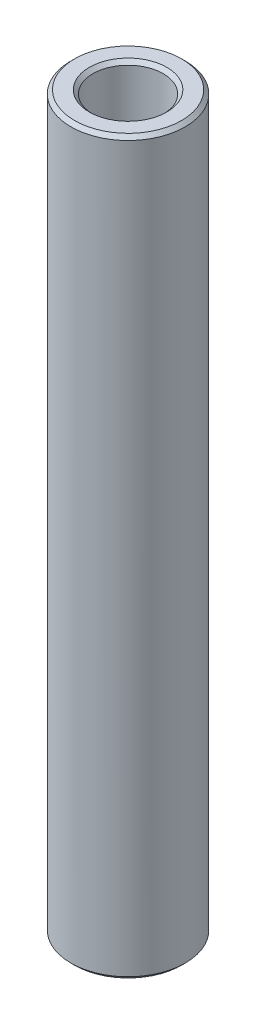
ISO-10303-21;
HEADER;
FILE_DESCRIPTION(('STEP AP214'),'2;1');
FILE_NAME('part.step','',(''),(''),'','','');
FILE_SCHEMA(('AUTOMOTIVE_DESIGN { 1 0 10303 214 1 1 1 1 }'));
ENDSEC;
DATA;
#1=APPLICATION_CONTEXT('core data for automotive mechanical design processes');
#2=APPLICATION_PROTOCOL_DEFINITION('international standard','automotive_design',2000,#1);
#3=PRODUCT_CONTEXT('',#1,'mechanical');
#4=PRODUCT('Part','Part','',(#3));
#5=PRODUCT_RELATED_PRODUCT_CATEGORY('part','',(#4));
#6=PRODUCT_DEFINITION_FORMATION('','',#4);
#7=PRODUCT_DEFINITION_CONTEXT('part definition',#1,'design');
#8=PRODUCT_DEFINITION('design','',#6,#7);
#9=PRODUCT_DEFINITION_SHAPE('','',#8);
#10=(LENGTH_UNIT() NAMED_UNIT(*) SI_UNIT(.MILLI.,.METRE.));
#11=(NAMED_UNIT(*) PLANE_ANGLE_UNIT() SI_UNIT($,.RADIAN.));
#12=(NAMED_UNIT(*) SI_UNIT($,.STERADIAN.) SOLID_ANGLE_UNIT());
#13=UNCERTAINTY_MEASURE_WITH_UNIT(LENGTH_MEASURE(1.E-05),#10,'distance_accuracy_value','');
#14=(GEOMETRIC_REPRESENTATION_CONTEXT(3) GLOBAL_UNCERTAINTY_ASSIGNED_CONTEXT((#13)) GLOBAL_UNIT_ASSIGNED_CONTEXT((#10,
#11,#12)) REPRESENTATION_CONTEXT('',''));
#15=CARTESIAN_POINT('',(0.,0.,0.));
#16=DIRECTION('',(0.,0.,1.));
#17=DIRECTION('',(1.,0.,0.));
#18=AXIS2_PLACEMENT_3D('',#15,#16,#17);
#19=CARTESIAN_POINT('',(0.,50.8,0.));
#20=DIRECTION('',(0.,-1.,0.));
#21=DIRECTION('',(0.,0.,-1.));
#22=AXIS2_PLACEMENT_3D('',#19,#20,#21);
#23=CYLINDRICAL_SURFACE('',#22,2.4384);
#24=CARTESIAN_POINT('',(0.,50.5459999999971,0.));
#25=DIRECTION('',(0.,1.,0.));
#26=DIRECTION('',(0.,0.,1.));
#27=AXIS2_PLACEMENT_3D('',#24,#25,#26);
#28=CIRCLE('',#27,2.43840000001683);
#29=CARTESIAN_POINT('',(0.,50.5459999999971,2.43840000001683));
#30=VERTEX_POINT('',#29);
#31=EDGE_CURVE('E34',#30,#30,#28,.T.);
#32=ORIENTED_EDGE('',*,*,#31,.T.);
#33=EDGE_LOOP('',(#32));
#34=FACE_BOUND('',#33,.T.);
#35=CARTESIAN_POINT('',(0.,0.253999999983989,0.));
#36=DIRECTION('',(0.,-1.,0.));
#37=DIRECTION('',(0.,0.,-1.));
#38=AXIS2_PLACEMENT_3D('',#35,#36,#37);
#39=CIRCLE('',#38,2.43840000007367);
#40=CARTESIAN_POINT('',(0.,0.253999999983989,-2.43840000007367));
#41=VERTEX_POINT('',#40);
#42=EDGE_CURVE('E38',#41,#41,#39,.T.);
#43=ORIENTED_EDGE('',*,*,#42,.T.);
#44=EDGE_LOOP('',(#43));
#45=FACE_BOUND('',#44,.T.);
#46=ADVANCED_FACE('F15',(#34,#45),#23,.F.);
#47=CARTESIAN_POINT('',(0.,0.,0.));
#48=DIRECTION('',(0.,-1.,0.));
#49=DIRECTION('',(0.,0.,-1.));
#50=AXIS2_PLACEMENT_3D('',#47,#48,#49);
#51=CONICAL_SURFACE('',#50,2.69240000005766,0.785398163397448);
#52=CARTESIAN_POINT('',(0.,0.,0.));
#53=DIRECTION('',(0.,-1.,0.));
#54=DIRECTION('',(0.,0.,-1.));
#55=AXIS2_PLACEMENT_3D('',#52,#53,#54);
#56=CIRCLE('',#55,2.69240000005766);
#57=CARTESIAN_POINT('',(0.,0.,-2.69240000005766));
#58=VERTEX_POINT('',#57);
#59=EDGE_CURVE('E37',#58,#58,#56,.T.);
#60=ORIENTED_EDGE('',*,*,#59,.T.);
#61=EDGE_LOOP('',(#60));
#62=FACE_BOUND('',#61,.T.);
#63=ORIENTED_EDGE('',*,*,#42,.F.);
#64=EDGE_LOOP('',(#63));
#65=FACE_BOUND('',#64,.T.);
#66=ADVANCED_FACE('F61',(#62,#65),#51,.F.);
#67=CARTESIAN_POINT('',(0.,50.7999999999242,0.));
#68=DIRECTION('',(0.,1.,0.));
#69=DIRECTION('',(-1.,0.,0.));
#70=AXIS2_PLACEMENT_3D('',#67,#68,#69);
#71=CONICAL_SURFACE('',#70,2.69239999994397,0.785398163397448);
#72=ORIENTED_EDGE('',*,*,#31,.F.);
#73=EDGE_LOOP('',(#72));
#74=FACE_BOUND('',#73,.T.);
#75=CARTESIAN_POINT('',(0.,50.7999999999811,0.));
#76=DIRECTION('',(0.,1.,0.));
#77=DIRECTION('',(-1.,0.,0.));
#78=AXIS2_PLACEMENT_3D('',#75,#76,#77);
#79=CIRCLE('',#78,2.69240000000082);
#80=CARTESIAN_POINT('',(-2.69240000000082,50.7999999999811,0.));
#81=VERTEX_POINT('',#80);
#82=EDGE_CURVE('E52',#81,#81,#79,.F.);
#83=ORIENTED_EDGE('',*,*,#82,.F.);
#84=EDGE_LOOP('',(#83));
#85=FACE_BOUND('',#84,.T.);
#86=ADVANCED_FACE('F68',(#74,#85),#71,.F.);
#87=CARTESIAN_POINT('',(0.,0.,0.));
#88=DIRECTION('',(0.,1.,0.));
#89=DIRECTION('',(0.,0.,1.));
#90=AXIS2_PLACEMENT_3D('',#87,#88,#89);
#91=PLANE('',#90);
#92=ORIENTED_EDGE('',*,*,#59,.F.);
#93=EDGE_LOOP('',(#92));
#94=FACE_BOUND('',#93,.T.);
#95=CARTESIAN_POINT('',(0.,-5.6843418860808E-11,0.));
#96=DIRECTION('',(0.,1.,0.));
#97=DIRECTION('',(0.,0.,1.));
#98=AXIS2_PLACEMENT_3D('',#95,#96,#97);
#99=CIRCLE('',#98,3.7147499999719);
#100=CARTESIAN_POINT('',(0.,-5.6843418860808E-11,3.7147499999719));
#101=VERTEX_POINT('',#100);
#102=EDGE_CURVE('E47',#101,#101,#99,.T.);
#103=ORIENTED_EDGE('',*,*,#102,.F.);
#104=EDGE_LOOP('',(#103));
#105=FACE_BOUND('',#104,.T.);
#106=ADVANCED_FACE('F64',(#94,#105),#91,.F.);
#107=CARTESIAN_POINT('',(0.,50.8,0.));
#108=DIRECTION('',(0.,1.,0.));
#109=DIRECTION('',(0.,0.,1.));
#110=AXIS2_PLACEMENT_3D('',#107,#108,#109);
#111=PLANE('',#110);
#112=ORIENTED_EDGE('',*,*,#82,.T.);
#113=EDGE_LOOP('',(#112));
#114=FACE_BOUND('',#113,.T.);
#115=CARTESIAN_POINT('',(0.,50.7999999999242,0.));
#116=DIRECTION('',(0.,-1.,0.));
#117=DIRECTION('',(1.,0.,0.));
#118=AXIS2_PLACEMENT_3D('',#115,#116,#117);
#119=CIRCLE('',#118,3.71475000002874);
#120=CARTESIAN_POINT('',(3.71475000002874,50.7999999999242,0.));
#121=VERTEX_POINT('',#120);
#122=EDGE_CURVE('E27',#121,#121,#119,.T.);
#123=ORIENTED_EDGE('',*,*,#122,.F.);
#124=EDGE_LOOP('',(#123));
#125=FACE_BOUND('',#124,.T.);
#126=ADVANCED_FACE('F67',(#114,#125),#111,.T.);
#127=CARTESIAN_POINT('',(0.,0.253999999870302,0.));
#128=DIRECTION('',(0.,1.,0.));
#129=DIRECTION('',(0.,0.,1.));
#130=AXIS2_PLACEMENT_3D('',#127,#128,#129);
#131=CONICAL_SURFACE('',#130,3.96874999989905,0.785398163397448);
#132=CARTESIAN_POINT('',(0.,0.25399999999999,0.));
#133=DIRECTION('',(0.,-1.,0.));
#134=DIRECTION('',(0.,0.,-1.));
#135=AXIS2_PLACEMENT_3D('',#132,#133,#134);
#136=CIRCLE('',#135,3.96875);
#137=CARTESIAN_POINT('',(0.,0.25399999999999,-3.96875));
#138=VERTEX_POINT('',#137);
#139=EDGE_CURVE('E22',#138,#138,#136,.F.);
#140=ORIENTED_EDGE('',*,*,#139,.F.);
#141=EDGE_LOOP('',(#140));
#142=FACE_BOUND('',#141,.T.);
#143=ORIENTED_EDGE('',*,*,#102,.T.);
#144=EDGE_LOOP('',(#143));
#145=FACE_BOUND('',#144,.T.);
#146=ADVANCED_FACE('F72',(#142,#145),#131,.T.);
#147=CARTESIAN_POINT('',(0.,50.5459999998834,0.));
#148=DIRECTION('',(0.,-1.,0.));
#149=DIRECTION('',(1.,0.,0.));
#150=AXIS2_PLACEMENT_3D('',#147,#148,#149);
#151=CONICAL_SURFACE('',#150,3.96875000006958,0.785398163397448);
#152=ORIENTED_EDGE('',*,*,#122,.T.);
#153=EDGE_LOOP('',(#152));
#154=FACE_BOUND('',#153,.T.);
#155=CARTESIAN_POINT('',(0.,50.546,0.));
#156=DIRECTION('',(0.,-1.,0.));
#157=DIRECTION('',(0.,0.,-1.));
#158=AXIS2_PLACEMENT_3D('',#155,#156,#157);
#159=CIRCLE('',#158,3.96875);
#160=CARTESIAN_POINT('',(0.,50.546,-3.96875));
#161=VERTEX_POINT('',#160);
#162=EDGE_CURVE('E10',#161,#161,#159,.T.);
#163=ORIENTED_EDGE('',*,*,#162,.F.);
#164=EDGE_LOOP('',(#163));
#165=FACE_BOUND('',#164,.T.);
#166=ADVANCED_FACE('F74',(#154,#165),#151,.T.);
#167=CARTESIAN_POINT('',(0.,50.8,0.));
#168=DIRECTION('',(0.,-1.,0.));
#169=DIRECTION('',(0.,0.,-1.));
#170=AXIS2_PLACEMENT_3D('',#167,#168,#169);
#171=CYLINDRICAL_SURFACE('',#170,3.96875);
#172=ORIENTED_EDGE('',*,*,#162,.T.);
#173=EDGE_LOOP('',(#172));
#174=FACE_BOUND('',#173,.T.);
#175=ORIENTED_EDGE('',*,*,#139,.T.);
#176=EDGE_LOOP('',(#175));
#177=FACE_BOUND('',#176,.T.);
#178=ADVANCED_FACE('F82',(#174,#177),#171,.T.);
#179=CLOSED_SHELL('',(#46,#66,#86,#106,#126,#146,#166,#178));
#180=MANIFOLD_SOLID_BREP('B1',#179);
#181=ADVANCED_BREP_SHAPE_REPRESENTATION('',(#18,#180),#14);
#182=SHAPE_DEFINITION_REPRESENTATION(#9,#181);
ENDSEC;
END-ISO-10303-21;
